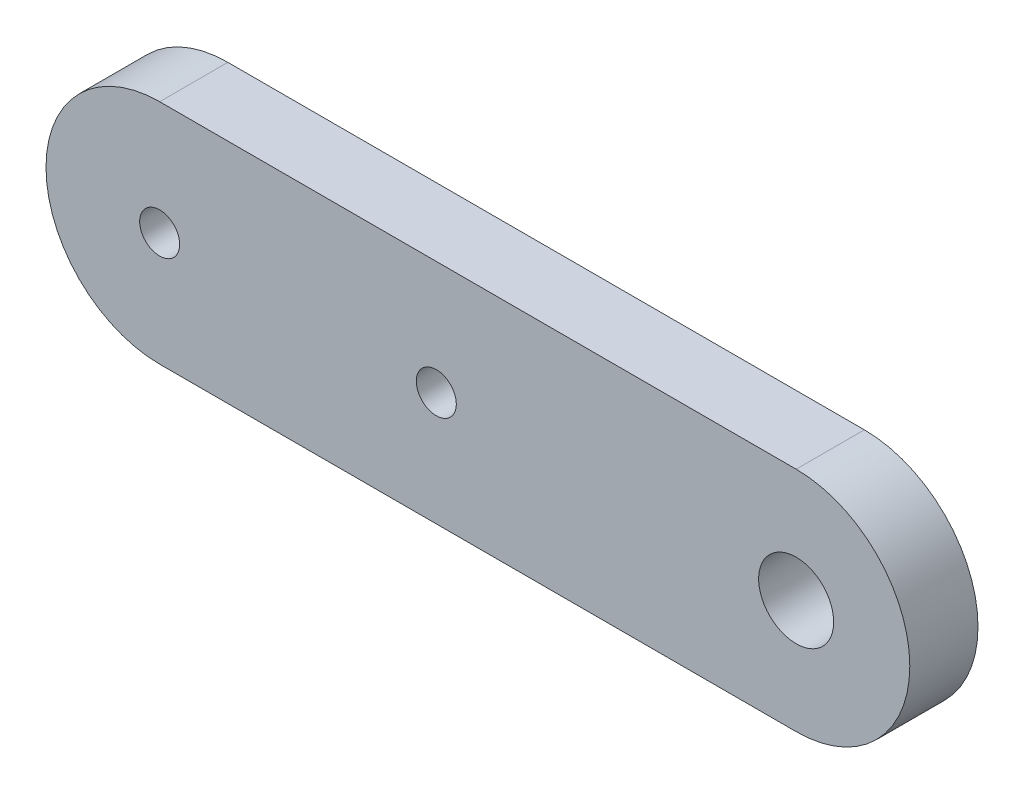
ISO-10303-21;
HEADER;
FILE_DESCRIPTION(('STEP AP214'),'2;1');
FILE_NAME('part.step','',(''),(''),'','','');
FILE_SCHEMA(('AUTOMOTIVE_DESIGN { 1 0 10303 214 1 1 1 1 }'));
ENDSEC;
DATA;
#1=APPLICATION_CONTEXT('core data for automotive mechanical design processes');
#2=APPLICATION_PROTOCOL_DEFINITION('international standard','automotive_design',2000,#1);
#3=PRODUCT_CONTEXT('',#1,'mechanical');
#4=PRODUCT('Part','Part','',(#3));
#5=PRODUCT_RELATED_PRODUCT_CATEGORY('part','',(#4));
#6=PRODUCT_DEFINITION_FORMATION('','',#4);
#7=PRODUCT_DEFINITION_CONTEXT('part definition',#1,'design');
#8=PRODUCT_DEFINITION('design','',#6,#7);
#9=PRODUCT_DEFINITION_SHAPE('','',#8);
#10=(LENGTH_UNIT() NAMED_UNIT(*) SI_UNIT(.MILLI.,.METRE.));
#11=(NAMED_UNIT(*) PLANE_ANGLE_UNIT() SI_UNIT($,.RADIAN.));
#12=(NAMED_UNIT(*) SI_UNIT($,.STERADIAN.) SOLID_ANGLE_UNIT());
#13=UNCERTAINTY_MEASURE_WITH_UNIT(LENGTH_MEASURE(1.E-05),#10,'distance_accuracy_value','');
#14=(GEOMETRIC_REPRESENTATION_CONTEXT(3) GLOBAL_UNCERTAINTY_ASSIGNED_CONTEXT((#13)) GLOBAL_UNIT_ASSIGNED_CONTEXT((#10,
#11,#12)) REPRESENTATION_CONTEXT('',''));
#15=CARTESIAN_POINT('',(0.,0.,0.));
#16=DIRECTION('',(0.,0.,1.));
#17=DIRECTION('',(1.,0.,0.));
#18=AXIS2_PLACEMENT_3D('',#15,#16,#17);
#19=CARTESIAN_POINT('',(0.,-5.,3.));
#20=DIRECTION('',(0.,0.,1.));
#21=DIRECTION('',(1.,0.,0.));
#22=AXIS2_PLACEMENT_3D('',#19,#20,#21);
#23=PLANE('',#22);
#24=CARTESIAN_POINT('',(28.,-5.,3.));
#25=DIRECTION('',(0.,0.,1.));
#26=DIRECTION('',(1.,0.,0.));
#27=AXIS2_PLACEMENT_3D('',#24,#25,#26);
#28=CIRCLE('',#27,1.65);
#29=CARTESIAN_POINT('',(29.65,-5.,3.));
#30=VERTEX_POINT('',#29);
#31=EDGE_CURVE('E117',#30,#30,#28,.T.);
#32=ORIENTED_EDGE('',*,*,#31,.F.);
#33=EDGE_LOOP('',(#32));
#34=FACE_BOUND('',#33,.T.);
#35=CARTESIAN_POINT('',(0.,-5.,3.));
#36=DIRECTION('',(0.,0.,1.));
#37=DIRECTION('',(1.,0.,0.));
#38=AXIS2_PLACEMENT_3D('',#35,#36,#37);
#39=CIRCLE('',#38,5.);
#40=CARTESIAN_POINT('',(0.,0.,3.));
#41=VERTEX_POINT('',#40);
#42=CARTESIAN_POINT('',(0.,-10.,3.));
#43=VERTEX_POINT('',#42);
#44=EDGE_CURVE('E87',#41,#43,#39,.T.);
#45=ORIENTED_EDGE('',*,*,#44,.T.);
#46=DIRECTION('',(1.,0.,0.));
#47=VECTOR('',#46,1.);
#48=CARTESIAN_POINT('',(0.,-10.,3.));
#49=LINE('',#48,#47);
#50=CARTESIAN_POINT('',(28.,-10.,3.));
#51=VERTEX_POINT('',#50);
#52=EDGE_CURVE('E82',#43,#51,#49,.T.);
#53=ORIENTED_EDGE('',*,*,#52,.T.);
#54=CARTESIAN_POINT('',(28.,-5.,3.));
#55=DIRECTION('',(0.,0.,1.));
#56=DIRECTION('',(-1.,0.,0.));
#57=AXIS2_PLACEMENT_3D('',#54,#55,#56);
#58=CIRCLE('',#57,5.);
#59=CARTESIAN_POINT('',(28.,0.,3.));
#60=VERTEX_POINT('',#59);
#61=EDGE_CURVE('E85',#51,#60,#58,.T.);
#62=ORIENTED_EDGE('',*,*,#61,.T.);
#63=DIRECTION('',(-1.,0.,0.));
#64=VECTOR('',#63,1.);
#65=CARTESIAN_POINT('',(0.,0.,3.));
#66=LINE('',#65,#64);
#67=EDGE_CURVE('E52',#60,#41,#66,.T.);
#68=ORIENTED_EDGE('',*,*,#67,.T.);
#69=EDGE_LOOP('',(#45,#53,#62,#68));
#70=FACE_BOUND('',#69,.T.);
#71=CARTESIAN_POINT('',(0.,-5.,3.));
#72=DIRECTION('',(0.,0.,1.));
#73=DIRECTION('',(1.,0.,0.));
#74=AXIS2_PLACEMENT_3D('',#71,#72,#73);
#75=CIRCLE('',#74,0.88);
#76=CARTESIAN_POINT('',(0.88,-5.,3.));
#77=VERTEX_POINT('',#76);
#78=EDGE_CURVE('E102',#77,#77,#75,.T.);
#79=ORIENTED_EDGE('',*,*,#78,.F.);
#80=EDGE_LOOP('',(#79));
#81=FACE_BOUND('',#80,.T.);
#82=CARTESIAN_POINT('',(12.17,-5.,3.));
#83=DIRECTION('',(0.,0.,1.));
#84=DIRECTION('',(1.,0.,0.));
#85=AXIS2_PLACEMENT_3D('',#82,#83,#84);
#86=CIRCLE('',#85,0.88);
#87=CARTESIAN_POINT('',(13.05,-5.,3.));
#88=VERTEX_POINT('',#87);
#89=EDGE_CURVE('E123',#88,#88,#86,.T.);
#90=ORIENTED_EDGE('',*,*,#89,.F.);
#91=EDGE_LOOP('',(#90));
#92=FACE_BOUND('',#91,.T.);
#93=ADVANCED_FACE('F35',(#34,#70,#81,#92),#23,.T.);
#94=CARTESIAN_POINT('',(0.,-5.,0.));
#95=DIRECTION('',(0.,0.,1.));
#96=DIRECTION('',(1.,0.,0.));
#97=AXIS2_PLACEMENT_3D('',#94,#95,#96);
#98=PLANE('',#97);
#99=CARTESIAN_POINT('',(0.,-5.,0.));
#100=DIRECTION('',(0.,0.,1.));
#101=DIRECTION('',(1.,0.,0.));
#102=AXIS2_PLACEMENT_3D('',#99,#100,#101);
#103=CIRCLE('',#102,5.);
#104=CARTESIAN_POINT('',(0.,0.,0.));
#105=VERTEX_POINT('',#104);
#106=CARTESIAN_POINT('',(0.,-10.,0.));
#107=VERTEX_POINT('',#106);
#108=EDGE_CURVE('E99',#105,#107,#103,.T.);
#109=ORIENTED_EDGE('',*,*,#108,.F.);
#110=DIRECTION('',(-1.,0.,0.));
#111=VECTOR('',#110,1.);
#112=CARTESIAN_POINT('',(0.,0.,0.));
#113=LINE('',#112,#111);
#114=CARTESIAN_POINT('',(28.,0.,0.));
#115=VERTEX_POINT('',#114);
#116=EDGE_CURVE('E75',#115,#105,#113,.T.);
#117=ORIENTED_EDGE('',*,*,#116,.F.);
#118=CARTESIAN_POINT('',(28.,-5.,0.));
#119=DIRECTION('',(0.,0.,1.));
#120=DIRECTION('',(-1.,0.,0.));
#121=AXIS2_PLACEMENT_3D('',#118,#119,#120);
#122=CIRCLE('',#121,5.);
#123=CARTESIAN_POINT('',(28.,-10.,0.));
#124=VERTEX_POINT('',#123);
#125=EDGE_CURVE('E69',#124,#115,#122,.T.);
#126=ORIENTED_EDGE('',*,*,#125,.F.);
#127=DIRECTION('',(1.,0.,0.));
#128=VECTOR('',#127,1.);
#129=CARTESIAN_POINT('',(0.,-10.,0.));
#130=LINE('',#129,#128);
#131=EDGE_CURVE('E91',#107,#124,#130,.T.);
#132=ORIENTED_EDGE('',*,*,#131,.F.);
#133=EDGE_LOOP('',(#109,#117,#126,#132));
#134=FACE_BOUND('',#133,.T.);
#135=CARTESIAN_POINT('',(0.,-5.,0.));
#136=DIRECTION('',(0.,0.,1.));
#137=DIRECTION('',(1.,0.,0.));
#138=AXIS2_PLACEMENT_3D('',#135,#136,#137);
#139=CIRCLE('',#138,0.88);
#140=CARTESIAN_POINT('',(0.88,-5.,0.));
#141=VERTEX_POINT('',#140);
#142=EDGE_CURVE('E114',#141,#141,#139,.T.);
#143=ORIENTED_EDGE('',*,*,#142,.T.);
#144=EDGE_LOOP('',(#143));
#145=FACE_BOUND('',#144,.T.);
#146=CARTESIAN_POINT('',(28.,-5.,0.));
#147=DIRECTION('',(0.,0.,1.));
#148=DIRECTION('',(1.,0.,0.));
#149=AXIS2_PLACEMENT_3D('',#146,#147,#148);
#150=CIRCLE('',#149,1.65);
#151=CARTESIAN_POINT('',(29.65,-5.,0.));
#152=VERTEX_POINT('',#151);
#153=EDGE_CURVE('E120',#152,#152,#150,.T.);
#154=ORIENTED_EDGE('',*,*,#153,.T.);
#155=EDGE_LOOP('',(#154));
#156=FACE_BOUND('',#155,.T.);
#157=CARTESIAN_POINT('',(12.17,-5.,0.));
#158=DIRECTION('',(0.,0.,1.));
#159=DIRECTION('',(1.,0.,0.));
#160=AXIS2_PLACEMENT_3D('',#157,#158,#159);
#161=CIRCLE('',#160,0.88);
#162=CARTESIAN_POINT('',(13.05,-5.,0.));
#163=VERTEX_POINT('',#162);
#164=EDGE_CURVE('E126',#163,#163,#161,.T.);
#165=ORIENTED_EDGE('',*,*,#164,.T.);
#166=EDGE_LOOP('',(#165));
#167=FACE_BOUND('',#166,.T.);
#168=ADVANCED_FACE('F110',(#134,#145,#156,#167),#98,.F.);
#169=CARTESIAN_POINT('',(0.,-5.,3.));
#170=DIRECTION('',(0.,0.,-1.));
#171=DIRECTION('',(-1.,0.,0.));
#172=AXIS2_PLACEMENT_3D('',#169,#170,#171);
#173=CYLINDRICAL_SURFACE('',#172,5.);
#174=ORIENTED_EDGE('',*,*,#108,.T.);
#175=DIRECTION('',(0.,0.,-1.));
#176=VECTOR('',#175,1.);
#177=CARTESIAN_POINT('',(0.,-10.,3.));
#178=LINE('',#177,#176);
#179=EDGE_CURVE('E11',#43,#107,#178,.T.);
#180=ORIENTED_EDGE('',*,*,#179,.F.);
#181=ORIENTED_EDGE('',*,*,#44,.F.);
#182=DIRECTION('',(0.,0.,-1.));
#183=VECTOR('',#182,1.);
#184=CARTESIAN_POINT('',(0.,0.,3.));
#185=LINE('',#184,#183);
#186=EDGE_CURVE('E95',#41,#105,#185,.T.);
#187=ORIENTED_EDGE('',*,*,#186,.T.);
#188=EDGE_LOOP('',(#174,#180,#181,#187));
#189=FACE_BOUND('',#188,.T.);
#190=ADVANCED_FACE('F37',(#189),#173,.T.);
#191=CARTESIAN_POINT('',(0.,-10.,3.));
#192=DIRECTION('',(0.,1.,0.));
#193=DIRECTION('',(0.,0.,1.));
#194=AXIS2_PLACEMENT_3D('',#191,#192,#193);
#195=PLANE('',#194);
#196=ORIENTED_EDGE('',*,*,#131,.T.);
#197=DIRECTION('',(0.,0.,-1.));
#198=VECTOR('',#197,1.);
#199=CARTESIAN_POINT('',(28.,-10.,3.));
#200=LINE('',#199,#198);
#201=EDGE_CURVE('E44',#51,#124,#200,.T.);
#202=ORIENTED_EDGE('',*,*,#201,.F.);
#203=ORIENTED_EDGE('',*,*,#52,.F.);
#204=ORIENTED_EDGE('',*,*,#179,.T.);
#205=EDGE_LOOP('',(#196,#202,#203,#204));
#206=FACE_BOUND('',#205,.T.);
#207=ADVANCED_FACE('F90',(#206),#195,.F.);
#208=CARTESIAN_POINT('',(28.,-5.,3.));
#209=DIRECTION('',(0.,0.,-1.));
#210=DIRECTION('',(-1.,0.,0.));
#211=AXIS2_PLACEMENT_3D('',#208,#209,#210);
#212=CYLINDRICAL_SURFACE('',#211,5.);
#213=ORIENTED_EDGE('',*,*,#125,.T.);
#214=DIRECTION('',(0.,0.,-1.));
#215=VECTOR('',#214,1.);
#216=CARTESIAN_POINT('',(28.,0.,3.));
#217=LINE('',#216,#215);
#218=EDGE_CURVE('E92',#60,#115,#217,.T.);
#219=ORIENTED_EDGE('',*,*,#218,.F.);
#220=ORIENTED_EDGE('',*,*,#61,.F.);
#221=ORIENTED_EDGE('',*,*,#201,.T.);
#222=EDGE_LOOP('',(#213,#219,#220,#221));
#223=FACE_BOUND('',#222,.T.);
#224=ADVANCED_FACE('F93',(#223),#212,.T.);
#225=CARTESIAN_POINT('',(0.,0.,3.));
#226=DIRECTION('',(0.,-1.,0.));
#227=DIRECTION('',(0.,0.,-1.));
#228=AXIS2_PLACEMENT_3D('',#225,#226,#227);
#229=PLANE('',#228);
#230=ORIENTED_EDGE('',*,*,#116,.T.);
#231=ORIENTED_EDGE('',*,*,#186,.F.);
#232=ORIENTED_EDGE('',*,*,#67,.F.);
#233=ORIENTED_EDGE('',*,*,#218,.T.);
#234=EDGE_LOOP('',(#230,#231,#232,#233));
#235=FACE_BOUND('',#234,.T.);
#236=ADVANCED_FACE('F107',(#235),#229,.F.);
#237=CARTESIAN_POINT('',(0.,-5.,3.));
#238=DIRECTION('',(0.,0.,-1.));
#239=DIRECTION('',(-1.,0.,0.));
#240=AXIS2_PLACEMENT_3D('',#237,#238,#239);
#241=CYLINDRICAL_SURFACE('',#240,0.88);
#242=ORIENTED_EDGE('',*,*,#78,.T.);
#243=EDGE_LOOP('',(#242));
#244=FACE_BOUND('',#243,.T.);
#245=ORIENTED_EDGE('',*,*,#142,.F.);
#246=EDGE_LOOP('',(#245));
#247=FACE_BOUND('',#246,.T.);
#248=ADVANCED_FACE('F144',(#244,#247),#241,.F.);
#249=CARTESIAN_POINT('',(28.,-5.,3.));
#250=DIRECTION('',(0.,0.,-1.));
#251=DIRECTION('',(-1.,0.,0.));
#252=AXIS2_PLACEMENT_3D('',#249,#250,#251);
#253=CYLINDRICAL_SURFACE('',#252,1.65);
#254=ORIENTED_EDGE('',*,*,#31,.T.);
#255=EDGE_LOOP('',(#254));
#256=FACE_BOUND('',#255,.T.);
#257=ORIENTED_EDGE('',*,*,#153,.F.);
#258=EDGE_LOOP('',(#257));
#259=FACE_BOUND('',#258,.T.);
#260=ADVANCED_FACE('F190',(#256,#259),#253,.F.);
#261=CARTESIAN_POINT('',(12.17,-5.,3.));
#262=DIRECTION('',(0.,0.,-1.));
#263=DIRECTION('',(-1.,0.,0.));
#264=AXIS2_PLACEMENT_3D('',#261,#262,#263);
#265=CYLINDRICAL_SURFACE('',#264,0.88);
#266=ORIENTED_EDGE('',*,*,#89,.T.);
#267=EDGE_LOOP('',(#266));
#268=FACE_BOUND('',#267,.T.);
#269=ORIENTED_EDGE('',*,*,#164,.F.);
#270=EDGE_LOOP('',(#269));
#271=FACE_BOUND('',#270,.T.);
#272=ADVANCED_FACE('F132',(#268,#271),#265,.F.);
#273=CLOSED_SHELL('',(#93,#168,#190,#207,#224,#236,#248,#260,#272));
#274=MANIFOLD_SOLID_BREP('B2',#273);
#275=ADVANCED_BREP_SHAPE_REPRESENTATION('',(#18,#274),#14);
#276=SHAPE_DEFINITION_REPRESENTATION(#9,#275);
ENDSEC;
END-ISO-10303-21;
